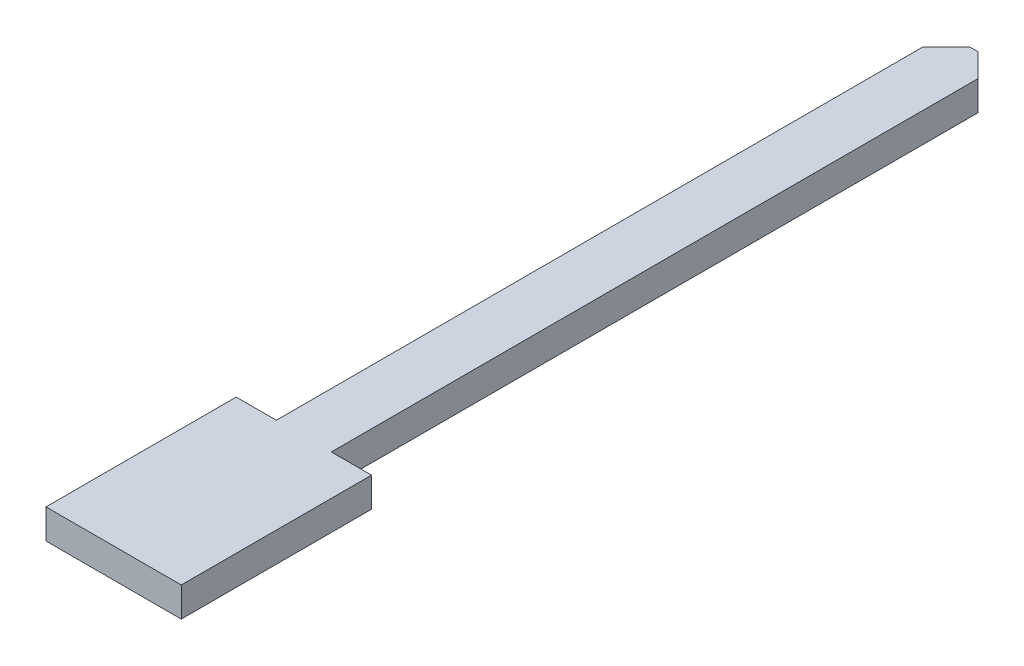
ISO-10303-21;
HEADER;
FILE_DESCRIPTION(('STEP AP214'),'2;1');
FILE_NAME('part.step','',(''),(''),'','','');
FILE_SCHEMA(('AUTOMOTIVE_DESIGN { 1 0 10303 214 1 1 1 1 }'));
ENDSEC;
DATA;
#1=APPLICATION_CONTEXT('core data for automotive mechanical design processes');
#2=APPLICATION_PROTOCOL_DEFINITION('international standard','automotive_design',2000,#1);
#3=PRODUCT_CONTEXT('',#1,'mechanical');
#4=PRODUCT('Part','Part','',(#3));
#5=PRODUCT_RELATED_PRODUCT_CATEGORY('part','',(#4));
#6=PRODUCT_DEFINITION_FORMATION('','',#4);
#7=PRODUCT_DEFINITION_CONTEXT('part definition',#1,'design');
#8=PRODUCT_DEFINITION('design','',#6,#7);
#9=PRODUCT_DEFINITION_SHAPE('','',#8);
#10=(LENGTH_UNIT() NAMED_UNIT(*) SI_UNIT(.MILLI.,.METRE.));
#11=(NAMED_UNIT(*) PLANE_ANGLE_UNIT() SI_UNIT($,.RADIAN.));
#12=(NAMED_UNIT(*) SI_UNIT($,.STERADIAN.) SOLID_ANGLE_UNIT());
#13=UNCERTAINTY_MEASURE_WITH_UNIT(LENGTH_MEASURE(1.E-05),#10,'distance_accuracy_value','');
#14=(GEOMETRIC_REPRESENTATION_CONTEXT(3) GLOBAL_UNCERTAINTY_ASSIGNED_CONTEXT((#13)) GLOBAL_UNIT_ASSIGNED_CONTEXT((#10,
#11,#12)) REPRESENTATION_CONTEXT('',''));
#15=CARTESIAN_POINT('',(0.,0.,0.));
#16=DIRECTION('',(0.,0.,1.));
#17=DIRECTION('',(1.,0.,0.));
#18=AXIS2_PLACEMENT_3D('',#15,#16,#17);
#19=CARTESIAN_POINT('',(-1.6,0.35,4.5));
#20=DIRECTION('',(0.,1.,0.));
#21=DIRECTION('',(0.,0.,1.));
#22=AXIS2_PLACEMENT_3D('',#19,#20,#21);
#23=PLANE('',#22);
#24=DIRECTION('',(0.,0.,-1.));
#25=VECTOR('',#24,1.);
#26=CARTESIAN_POINT('',(1.6,0.35,4.5));
#27=LINE('',#26,#25);
#28=CARTESIAN_POINT('',(1.6,0.35,0.));
#29=VERTEX_POINT('',#28);
#30=CARTESIAN_POINT('',(1.6,0.35,4.5));
#31=VERTEX_POINT('',#30);
#32=EDGE_CURVE('E127',#29,#31,#27,.F.);
#33=ORIENTED_EDGE('',*,*,#32,.F.);
#34=DIRECTION('',(-1.,0.,0.));
#35=VECTOR('',#34,1.);
#36=CARTESIAN_POINT('',(1.6,0.35,0.));
#37=LINE('',#36,#35);
#38=CARTESIAN_POINT('',(0.650000000000004,0.35,0.));
#39=VERTEX_POINT('',#38);
#40=EDGE_CURVE('E122',#39,#29,#37,.F.);
#41=ORIENTED_EDGE('',*,*,#40,.F.);
#42=DIRECTION('',(0.,0.,1.));
#43=VECTOR('',#42,1.);
#44=CARTESIAN_POINT('',(0.650000000000004,0.35,-15.85));
#45=LINE('',#44,#43);
#46=CARTESIAN_POINT('',(0.650000000000004,0.35,-15.3));
#47=VERTEX_POINT('',#46);
#48=EDGE_CURVE('E92',#39,#47,#45,.F.);
#49=ORIENTED_EDGE('',*,*,#48,.T.);
#50=DIRECTION('',(-0.707106781186547,0.,-0.707106781186548));
#51=VECTOR('',#50,1.);
#52=CARTESIAN_POINT('',(0.100000000000004,0.35,-15.85));
#53=LINE('',#52,#51);
#54=CARTESIAN_POINT('',(0.100000000000002,0.35,-15.85));
#55=VERTEX_POINT('',#54);
#56=EDGE_CURVE('E95',#55,#47,#53,.F.);
#57=ORIENTED_EDGE('',*,*,#56,.F.);
#58=DIRECTION('',(-1.,0.,0.));
#59=VECTOR('',#58,1.);
#60=CARTESIAN_POINT('',(0.650000000000004,0.35,-15.85));
#61=LINE('',#60,#59);
#62=CARTESIAN_POINT('',(-0.0999999999999965,0.35,-15.85));
#63=VERTEX_POINT('',#62);
#64=EDGE_CURVE('E98',#63,#55,#61,.F.);
#65=ORIENTED_EDGE('',*,*,#64,.F.);
#66=DIRECTION('',(-0.707106781186548,0.,0.707106781186547));
#67=VECTOR('',#66,1.);
#68=CARTESIAN_POINT('',(-0.099999999999997,0.35,-15.85));
#69=LINE('',#68,#67);
#70=CARTESIAN_POINT('',(-0.649999999999996,0.35,-15.3));
#71=VERTEX_POINT('',#70);
#72=EDGE_CURVE('E20',#63,#71,#69,.T.);
#73=ORIENTED_EDGE('',*,*,#72,.T.);
#74=DIRECTION('',(0.,0.,-1.));
#75=VECTOR('',#74,1.);
#76=CARTESIAN_POINT('',(-0.649999999999996,0.35,-15.85));
#77=LINE('',#76,#75);
#78=CARTESIAN_POINT('',(-0.649999999999996,0.35,0.));
#79=VERTEX_POINT('',#78);
#80=EDGE_CURVE('E146',#71,#79,#77,.F.);
#81=ORIENTED_EDGE('',*,*,#80,.T.);
#82=DIRECTION('',(-1.,0.,0.));
#83=VECTOR('',#82,1.);
#84=CARTESIAN_POINT('',(1.6,0.35,0.));
#85=LINE('',#84,#83);
#86=CARTESIAN_POINT('',(-1.6,0.35,0.));
#87=VERTEX_POINT('',#86);
#88=EDGE_CURVE('E142',#87,#79,#85,.F.);
#89=ORIENTED_EDGE('',*,*,#88,.F.);
#90=DIRECTION('',(0.,0.,1.));
#91=VECTOR('',#90,1.);
#92=CARTESIAN_POINT('',(-1.6,0.35,4.5));
#93=LINE('',#92,#91);
#94=CARTESIAN_POINT('',(-1.6,0.35,4.5));
#95=VERTEX_POINT('',#94);
#96=EDGE_CURVE('E137',#95,#87,#93,.F.);
#97=ORIENTED_EDGE('',*,*,#96,.F.);
#98=DIRECTION('',(-1.,0.,0.));
#99=VECTOR('',#98,1.);
#100=CARTESIAN_POINT('',(1.6,0.35,4.5));
#101=LINE('',#100,#99);
#102=EDGE_CURVE('E131',#95,#31,#101,.F.);
#103=ORIENTED_EDGE('',*,*,#102,.T.);
#104=EDGE_LOOP('',(#33,#41,#49,#57,#65,#73,#81,#89,#97,#103));
#105=FACE_BOUND('',#104,.T.);
#106=ADVANCED_FACE('F17',(#105),#23,.T.);
#107=CARTESIAN_POINT('',(0.650000000000004,0.35,-15.85));
#108=DIRECTION('',(0.,0.,-1.));
#109=DIRECTION('',(-1.,0.,0.));
#110=AXIS2_PLACEMENT_3D('',#107,#108,#109);
#111=PLANE('',#110);
#112=DIRECTION('',(1.,0.,0.));
#113=VECTOR('',#112,1.);
#114=CARTESIAN_POINT('',(1.6,-0.35,-15.85));
#115=LINE('',#114,#113);
#116=CARTESIAN_POINT('',(-0.0999999999999945,-0.35,-15.85));
#117=VERTEX_POINT('',#116);
#118=CARTESIAN_POINT('',(0.100000000000003,-0.35,-15.85));
#119=VERTEX_POINT('',#118);
#120=EDGE_CURVE('E151',#117,#119,#115,.T.);
#121=ORIENTED_EDGE('',*,*,#120,.F.);
#122=DIRECTION('',(0.,1.,0.));
#123=VECTOR('',#122,1.);
#124=CARTESIAN_POINT('',(-0.0999999999999966,0.35,-15.85));
#125=LINE('',#124,#123);
#126=EDGE_CURVE('E109',#63,#117,#125,.F.);
#127=ORIENTED_EDGE('',*,*,#126,.F.);
#128=ORIENTED_EDGE('',*,*,#64,.T.);
#129=DIRECTION('',(0.,1.,0.));
#130=VECTOR('',#129,1.);
#131=CARTESIAN_POINT('',(0.100000000000004,0.35,-15.85));
#132=LINE('',#131,#130);
#133=EDGE_CURVE('E103',#119,#55,#132,.T.);
#134=ORIENTED_EDGE('',*,*,#133,.F.);
#135=EDGE_LOOP('',(#121,#127,#128,#134));
#136=FACE_BOUND('',#135,.T.);
#137=ADVANCED_FACE('F106',(#136),#111,.T.);
#138=CARTESIAN_POINT('',(0.100000000000004,0.35,-15.85));
#139=DIRECTION('',(0.707106781186548,0.,-0.707106781186547));
#140=DIRECTION('',(-0.707106781186547,0.,-0.707106781186548));
#141=AXIS2_PLACEMENT_3D('',#138,#139,#140);
#142=PLANE('',#141);
#143=DIRECTION('',(0.707106781186549,0.,0.707106781186546));
#144=VECTOR('',#143,1.);
#145=CARTESIAN_POINT('',(0.100000000000004,-0.35,-15.85));
#146=LINE('',#145,#144);
#147=CARTESIAN_POINT('',(0.650000000000003,-0.35,-15.3));
#148=VERTEX_POINT('',#147);
#149=EDGE_CURVE('E112',#119,#148,#146,.T.);
#150=ORIENTED_EDGE('',*,*,#149,.F.);
#151=ORIENTED_EDGE('',*,*,#133,.T.);
#152=ORIENTED_EDGE('',*,*,#56,.T.);
#153=DIRECTION('',(0.,1.,0.));
#154=VECTOR('',#153,1.);
#155=CARTESIAN_POINT('',(0.650000000000004,0.35,-15.3));
#156=LINE('',#155,#154);
#157=EDGE_CURVE('E115',#47,#148,#156,.F.);
#158=ORIENTED_EDGE('',*,*,#157,.T.);
#159=EDGE_LOOP('',(#150,#151,#152,#158));
#160=FACE_BOUND('',#159,.T.);
#161=ADVANCED_FACE('F110',(#160),#142,.T.);
#162=CARTESIAN_POINT('',(0.650000000000004,0.35,-15.85));
#163=DIRECTION('',(-1.,0.,0.));
#164=DIRECTION('',(0.,0.,1.));
#165=AXIS2_PLACEMENT_3D('',#162,#163,#164);
#166=PLANE('',#165);
#167=ORIENTED_EDGE('',*,*,#157,.F.);
#168=ORIENTED_EDGE('',*,*,#48,.F.);
#169=DIRECTION('',(0.,1.,0.));
#170=VECTOR('',#169,1.);
#171=CARTESIAN_POINT('',(0.650000000000004,0.35,0.));
#172=LINE('',#171,#170);
#173=CARTESIAN_POINT('',(0.650000000000004,-0.35,0.));
#174=VERTEX_POINT('',#173);
#175=EDGE_CURVE('E119',#174,#39,#172,.T.);
#176=ORIENTED_EDGE('',*,*,#175,.F.);
#177=DIRECTION('',(0.,0.,-1.));
#178=VECTOR('',#177,1.);
#179=CARTESIAN_POINT('',(0.650000000000004,-0.35,4.5));
#180=LINE('',#179,#178);
#181=EDGE_CURVE('E154',#148,#174,#180,.F.);
#182=ORIENTED_EDGE('',*,*,#181,.F.);
#183=EDGE_LOOP('',(#167,#168,#176,#182));
#184=FACE_BOUND('',#183,.T.);
#185=ADVANCED_FACE('F211',(#184),#166,.F.);
#186=CARTESIAN_POINT('',(1.6,0.35,0.));
#187=DIRECTION('',(0.,0.,-1.));
#188=DIRECTION('',(-1.,0.,0.));
#189=AXIS2_PLACEMENT_3D('',#186,#187,#188);
#190=PLANE('',#189);
#191=DIRECTION('',(0.,1.,0.));
#192=VECTOR('',#191,1.);
#193=CARTESIAN_POINT('',(1.6,0.35,0.));
#194=LINE('',#193,#192);
#195=CARTESIAN_POINT('',(1.6,-0.35,0.));
#196=VERTEX_POINT('',#195);
#197=EDGE_CURVE('E124',#196,#29,#194,.T.);
#198=ORIENTED_EDGE('',*,*,#197,.F.);
#199=DIRECTION('',(1.,0.,0.));
#200=VECTOR('',#199,1.);
#201=CARTESIAN_POINT('',(1.6,-0.35,0.));
#202=LINE('',#201,#200);
#203=EDGE_CURVE('E157',#174,#196,#202,.T.);
#204=ORIENTED_EDGE('',*,*,#203,.F.);
#205=ORIENTED_EDGE('',*,*,#175,.T.);
#206=ORIENTED_EDGE('',*,*,#40,.T.);
#207=EDGE_LOOP('',(#198,#204,#205,#206));
#208=FACE_BOUND('',#207,.T.);
#209=ADVANCED_FACE('F207',(#208),#190,.T.);
#210=CARTESIAN_POINT('',(1.6,0.35,4.5));
#211=DIRECTION('',(1.,0.,0.));
#212=DIRECTION('',(0.,0.,-1.));
#213=AXIS2_PLACEMENT_3D('',#210,#211,#212);
#214=PLANE('',#213);
#215=DIRECTION('',(0.,1.,0.));
#216=VECTOR('',#215,1.);
#217=CARTESIAN_POINT('',(1.6,0.35,4.5));
#218=LINE('',#217,#216);
#219=CARTESIAN_POINT('',(1.6,-0.35,4.5));
#220=VERTEX_POINT('',#219);
#221=EDGE_CURVE('E129',#31,#220,#218,.F.);
#222=ORIENTED_EDGE('',*,*,#221,.T.);
#223=DIRECTION('',(0.,0.,-1.));
#224=VECTOR('',#223,1.);
#225=CARTESIAN_POINT('',(1.6,-0.35,4.5));
#226=LINE('',#225,#224);
#227=EDGE_CURVE('E160',#196,#220,#226,.F.);
#228=ORIENTED_EDGE('',*,*,#227,.F.);
#229=ORIENTED_EDGE('',*,*,#197,.T.);
#230=ORIENTED_EDGE('',*,*,#32,.T.);
#231=EDGE_LOOP('',(#222,#228,#229,#230));
#232=FACE_BOUND('',#231,.T.);
#233=ADVANCED_FACE('F203',(#232),#214,.T.);
#234=CARTESIAN_POINT('',(1.6,0.35,4.5));
#235=DIRECTION('',(0.,0.,-1.));
#236=DIRECTION('',(-1.,0.,0.));
#237=AXIS2_PLACEMENT_3D('',#234,#235,#236);
#238=PLANE('',#237);
#239=DIRECTION('',(0.,1.,0.));
#240=VECTOR('',#239,1.);
#241=CARTESIAN_POINT('',(-1.6,-0.35,4.5));
#242=LINE('',#241,#240);
#243=CARTESIAN_POINT('',(-1.6,-0.35,4.5));
#244=VERTEX_POINT('',#243);
#245=EDGE_CURVE('E134',#244,#95,#242,.T.);
#246=ORIENTED_EDGE('',*,*,#245,.F.);
#247=DIRECTION('',(1.,0.,0.));
#248=VECTOR('',#247,1.);
#249=CARTESIAN_POINT('',(1.6,-0.35,4.5));
#250=LINE('',#249,#248);
#251=EDGE_CURVE('E163',#220,#244,#250,.F.);
#252=ORIENTED_EDGE('',*,*,#251,.F.);
#253=ORIENTED_EDGE('',*,*,#221,.F.);
#254=ORIENTED_EDGE('',*,*,#102,.F.);
#255=EDGE_LOOP('',(#246,#252,#253,#254));
#256=FACE_BOUND('',#255,.T.);
#257=ADVANCED_FACE('F199',(#256),#238,.F.);
#258=CARTESIAN_POINT('',(-1.6,-0.35,4.5));
#259=DIRECTION('',(-1.,0.,0.));
#260=DIRECTION('',(0.,0.,1.));
#261=AXIS2_PLACEMENT_3D('',#258,#259,#260);
#262=PLANE('',#261);
#263=ORIENTED_EDGE('',*,*,#245,.T.);
#264=ORIENTED_EDGE('',*,*,#96,.T.);
#265=DIRECTION('',(0.,1.,0.));
#266=VECTOR('',#265,1.);
#267=CARTESIAN_POINT('',(-1.6,0.35,0.));
#268=LINE('',#267,#266);
#269=CARTESIAN_POINT('',(-1.6,-0.35,0.));
#270=VERTEX_POINT('',#269);
#271=EDGE_CURVE('E139',#270,#87,#268,.T.);
#272=ORIENTED_EDGE('',*,*,#271,.F.);
#273=DIRECTION('',(0.,0.,-1.));
#274=VECTOR('',#273,1.);
#275=CARTESIAN_POINT('',(-1.6,-0.35,4.5));
#276=LINE('',#275,#274);
#277=EDGE_CURVE('E166',#244,#270,#276,.T.);
#278=ORIENTED_EDGE('',*,*,#277,.F.);
#279=EDGE_LOOP('',(#263,#264,#272,#278));
#280=FACE_BOUND('',#279,.T.);
#281=ADVANCED_FACE('F196',(#280),#262,.T.);
#282=CARTESIAN_POINT('',(1.6,0.35,0.));
#283=DIRECTION('',(0.,0.,-1.));
#284=DIRECTION('',(-1.,0.,0.));
#285=AXIS2_PLACEMENT_3D('',#282,#283,#284);
#286=PLANE('',#285);
#287=ORIENTED_EDGE('',*,*,#271,.T.);
#288=ORIENTED_EDGE('',*,*,#88,.T.);
#289=DIRECTION('',(0.,1.,0.));
#290=VECTOR('',#289,1.);
#291=CARTESIAN_POINT('',(-0.649999999999996,-0.35,0.));
#292=LINE('',#291,#290);
#293=CARTESIAN_POINT('',(-0.649999999999996,-0.35,0.));
#294=VERTEX_POINT('',#293);
#295=EDGE_CURVE('E144',#79,#294,#292,.F.);
#296=ORIENTED_EDGE('',*,*,#295,.T.);
#297=DIRECTION('',(1.,0.,0.));
#298=VECTOR('',#297,1.);
#299=CARTESIAN_POINT('',(1.6,-0.35,0.));
#300=LINE('',#299,#298);
#301=EDGE_CURVE('E169',#270,#294,#300,.T.);
#302=ORIENTED_EDGE('',*,*,#301,.F.);
#303=EDGE_LOOP('',(#287,#288,#296,#302));
#304=FACE_BOUND('',#303,.T.);
#305=ADVANCED_FACE('F179',(#304),#286,.T.);
#306=CARTESIAN_POINT('',(-0.649999999999996,-0.35,-15.85));
#307=DIRECTION('',(1.,0.,0.));
#308=DIRECTION('',(0.,0.,-1.));
#309=AXIS2_PLACEMENT_3D('',#306,#307,#308);
#310=PLANE('',#309);
#311=DIRECTION('',(0.,1.,0.));
#312=VECTOR('',#311,1.);
#313=CARTESIAN_POINT('',(-0.649999999999994,0.35,-15.3));
#314=LINE('',#313,#312);
#315=CARTESIAN_POINT('',(-0.649999999999995,-0.35,-15.3));
#316=VERTEX_POINT('',#315);
#317=EDGE_CURVE('E35',#316,#71,#314,.T.);
#318=ORIENTED_EDGE('',*,*,#317,.F.);
#319=DIRECTION('',(0.,0.,-1.));
#320=VECTOR('',#319,1.);
#321=CARTESIAN_POINT('',(-0.649999999999996,-0.35,4.5));
#322=LINE('',#321,#320);
#323=EDGE_CURVE('E26',#294,#316,#322,.T.);
#324=ORIENTED_EDGE('',*,*,#323,.F.);
#325=ORIENTED_EDGE('',*,*,#295,.F.);
#326=ORIENTED_EDGE('',*,*,#80,.F.);
#327=EDGE_LOOP('',(#318,#324,#325,#326));
#328=FACE_BOUND('',#327,.T.);
#329=ADVANCED_FACE('F177',(#328),#310,.F.);
#330=CARTESIAN_POINT('',(-0.0999999999999965,0.35,-15.85));
#331=DIRECTION('',(-0.707106781186548,0.,-0.707106781186547));
#332=DIRECTION('',(-0.707106781186547,0.,0.707106781186548));
#333=AXIS2_PLACEMENT_3D('',#330,#331,#332);
#334=PLANE('',#333);
#335=ORIENTED_EDGE('',*,*,#72,.F.);
#336=ORIENTED_EDGE('',*,*,#126,.T.);
#337=DIRECTION('',(0.707106781186549,0.,-0.707106781186546));
#338=VECTOR('',#337,1.);
#339=CARTESIAN_POINT('',(-0.649999999999995,-0.35,-15.3));
#340=LINE('',#339,#338);
#341=EDGE_CURVE('E11',#316,#117,#340,.T.);
#342=ORIENTED_EDGE('',*,*,#341,.F.);
#343=ORIENTED_EDGE('',*,*,#317,.T.);
#344=EDGE_LOOP('',(#335,#336,#342,#343));
#345=FACE_BOUND('',#344,.T.);
#346=ADVANCED_FACE('F183',(#345),#334,.T.);
#347=CARTESIAN_POINT('',(1.6,-0.35,4.5));
#348=DIRECTION('',(0.,-1.,0.));
#349=DIRECTION('',(0.,0.,-1.));
#350=AXIS2_PLACEMENT_3D('',#347,#348,#349);
#351=PLANE('',#350);
#352=ORIENTED_EDGE('',*,*,#323,.T.);
#353=ORIENTED_EDGE('',*,*,#341,.T.);
#354=ORIENTED_EDGE('',*,*,#120,.T.);
#355=ORIENTED_EDGE('',*,*,#149,.T.);
#356=ORIENTED_EDGE('',*,*,#181,.T.);
#357=ORIENTED_EDGE('',*,*,#203,.T.);
#358=ORIENTED_EDGE('',*,*,#227,.T.);
#359=ORIENTED_EDGE('',*,*,#251,.T.);
#360=ORIENTED_EDGE('',*,*,#277,.T.);
#361=ORIENTED_EDGE('',*,*,#301,.T.);
#362=EDGE_LOOP('',(#352,#353,#354,#355,#356,#357,#358,#359,#360,#361));
#363=FACE_BOUND('',#362,.T.);
#364=ADVANCED_FACE('F174',(#363),#351,.T.);
#365=CLOSED_SHELL('',(#106,#137,#161,#185,#209,#233,#257,#281,#305,#329,#346,#364));
#366=MANIFOLD_SOLID_BREP('B1',#365);
#367=ADVANCED_BREP_SHAPE_REPRESENTATION('',(#18,#366),#14);
#368=SHAPE_DEFINITION_REPRESENTATION(#9,#367);
ENDSEC;
END-ISO-10303-21;
